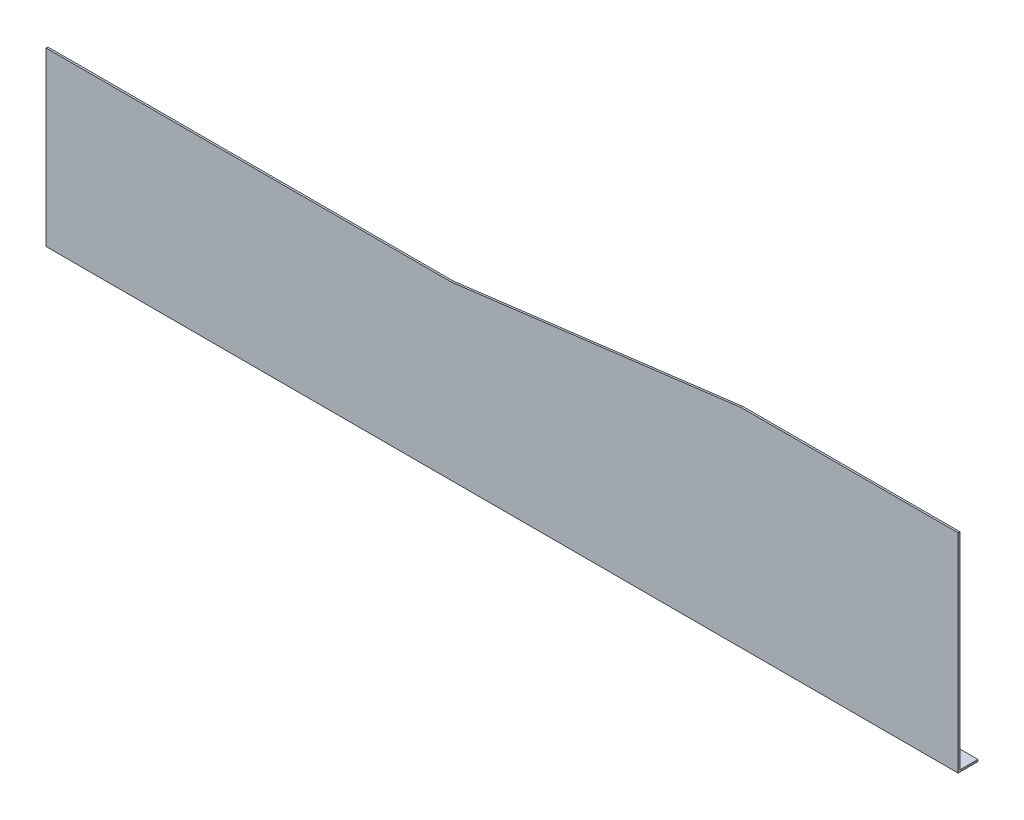
ISO-10303-21;
HEADER;
FILE_DESCRIPTION(('STEP AP214'),'2;1');
FILE_NAME('part.step','',(''),(''),'','','');
FILE_SCHEMA(('AUTOMOTIVE_DESIGN { 1 0 10303 214 1 1 1 1 }'));
ENDSEC;
DATA;
#1=APPLICATION_CONTEXT('core data for automotive mechanical design processes');
#2=APPLICATION_PROTOCOL_DEFINITION('international standard','automotive_design',2000,#1);
#3=PRODUCT_CONTEXT('',#1,'mechanical');
#4=PRODUCT('Part','Part','',(#3));
#5=PRODUCT_RELATED_PRODUCT_CATEGORY('part','',(#4));
#6=PRODUCT_DEFINITION_FORMATION('','',#4);
#7=PRODUCT_DEFINITION_CONTEXT('part definition',#1,'design');
#8=PRODUCT_DEFINITION('design','',#6,#7);
#9=PRODUCT_DEFINITION_SHAPE('','',#8);
#10=(LENGTH_UNIT() NAMED_UNIT(*) SI_UNIT(.MILLI.,.METRE.));
#11=(NAMED_UNIT(*) PLANE_ANGLE_UNIT() SI_UNIT($,.RADIAN.));
#12=(NAMED_UNIT(*) SI_UNIT($,.STERADIAN.) SOLID_ANGLE_UNIT());
#13=UNCERTAINTY_MEASURE_WITH_UNIT(LENGTH_MEASURE(1.E-05),#10,'distance_accuracy_value','');
#14=(GEOMETRIC_REPRESENTATION_CONTEXT(3) GLOBAL_UNCERTAINTY_ASSIGNED_CONTEXT((#13)) GLOBAL_UNIT_ASSIGNED_CONTEXT((#10,
#11,#12)) REPRESENTATION_CONTEXT('',''));
#15=CARTESIAN_POINT('',(0.,0.,0.));
#16=DIRECTION('',(0.,0.,1.));
#17=DIRECTION('',(1.,0.,0.));
#18=AXIS2_PLACEMENT_3D('',#15,#16,#17);
#19=CARTESIAN_POINT('',(630.,0.,1.27));
#20=DIRECTION('',(0.,1.,0.));
#21=DIRECTION('',(-1.,0.,0.));
#22=AXIS2_PLACEMENT_3D('',#19,#20,#21);
#23=PLANE('',#22);
#24=DIRECTION('',(0.,0.,-1.));
#25=VECTOR('',#24,1.);
#26=CARTESIAN_POINT('',(0.,0.,1.27));
#27=LINE('',#26,#25);
#28=CARTESIAN_POINT('',(0.,0.,1.27));
#29=VERTEX_POINT('',#28);
#30=CARTESIAN_POINT('',(0.,0.,-12.5));
#31=VERTEX_POINT('',#30);
#32=EDGE_CURVE('E113',#29,#31,#27,.T.);
#33=ORIENTED_EDGE('',*,*,#32,.T.);
#34=DIRECTION('',(1.,0.,0.));
#35=VECTOR('',#34,1.);
#36=CARTESIAN_POINT('',(0.,0.,-12.5));
#37=LINE('',#36,#35);
#38=CARTESIAN_POINT('',(630.,0.,-12.5));
#39=VERTEX_POINT('',#38);
#40=EDGE_CURVE('E152',#31,#39,#37,.T.);
#41=ORIENTED_EDGE('',*,*,#40,.T.);
#42=DIRECTION('',(0.,0.,-1.));
#43=VECTOR('',#42,1.);
#44=CARTESIAN_POINT('',(630.,0.,1.27));
#45=LINE('',#44,#43);
#46=CARTESIAN_POINT('',(630.,0.,1.27));
#47=VERTEX_POINT('',#46);
#48=EDGE_CURVE('E47',#47,#39,#45,.T.);
#49=ORIENTED_EDGE('',*,*,#48,.F.);
#50=DIRECTION('',(1.,0.,0.));
#51=VECTOR('',#50,1.);
#52=CARTESIAN_POINT('',(630.,0.,1.27));
#53=LINE('',#52,#51);
#54=EDGE_CURVE('E127',#29,#47,#53,.T.);
#55=ORIENTED_EDGE('',*,*,#54,.F.);
#56=EDGE_LOOP('',(#33,#41,#49,#55));
#57=FACE_BOUND('',#56,.T.);
#58=ADVANCED_FACE('F39',(#57),#23,.F.);
#59=CARTESIAN_POINT('',(630.,143.73,1.27));
#60=DIRECTION('',(-1.,0.,0.));
#61=DIRECTION('',(0.,0.,1.));
#62=AXIS2_PLACEMENT_3D('',#59,#60,#61);
#63=PLANE('',#62);
#64=DIRECTION('',(0.,0.,-1.));
#65=VECTOR('',#64,1.);
#66=CARTESIAN_POINT('',(630.,143.73,1.27));
#67=LINE('',#66,#65);
#68=CARTESIAN_POINT('',(630.,143.73,1.27));
#69=VERTEX_POINT('',#68);
#70=CARTESIAN_POINT('',(630.,143.73,0.));
#71=VERTEX_POINT('',#70);
#72=EDGE_CURVE('E132',#69,#71,#67,.T.);
#73=ORIENTED_EDGE('',*,*,#72,.F.);
#74=DIRECTION('',(0.,1.,0.));
#75=VECTOR('',#74,1.);
#76=CARTESIAN_POINT('',(630.,143.73,1.27));
#77=LINE('',#76,#75);
#78=EDGE_CURVE('E89',#47,#69,#77,.T.);
#79=ORIENTED_EDGE('',*,*,#78,.F.);
#80=ORIENTED_EDGE('',*,*,#48,.T.);
#81=DIRECTION('',(0.,1.,0.));
#82=VECTOR('',#81,1.);
#83=CARTESIAN_POINT('',(630.,0.,-12.5));
#84=LINE('',#83,#82);
#85=CARTESIAN_POINT('',(630.,1.27,-12.5));
#86=VERTEX_POINT('',#85);
#87=EDGE_CURVE('E141',#39,#86,#84,.T.);
#88=ORIENTED_EDGE('',*,*,#87,.T.);
#89=DIRECTION('',(0.,0.,1.));
#90=VECTOR('',#89,1.);
#91=CARTESIAN_POINT('',(630.,1.27,-12.5));
#92=LINE('',#91,#90);
#93=CARTESIAN_POINT('',(630.,1.27,0.));
#94=VERTEX_POINT('',#93);
#95=EDGE_CURVE('E162',#86,#94,#92,.T.);
#96=ORIENTED_EDGE('',*,*,#95,.T.);
#97=DIRECTION('',(0.,1.,0.));
#98=VECTOR('',#97,1.);
#99=CARTESIAN_POINT('',(630.,143.73,0.));
#100=LINE('',#99,#98);
#101=EDGE_CURVE('E117',#94,#71,#100,.T.);
#102=ORIENTED_EDGE('',*,*,#101,.T.);
#103=EDGE_LOOP('',(#73,#79,#80,#88,#96,#102));
#104=FACE_BOUND('',#103,.T.);
#105=ADVANCED_FACE('F138',(#104),#63,.F.);
#106=CARTESIAN_POINT('',(480.,143.73,1.27));
#107=DIRECTION('',(0.,-1.,0.));
#108=DIRECTION('',(1.,0.,0.));
#109=AXIS2_PLACEMENT_3D('',#106,#107,#108);
#110=PLANE('',#109);
#111=DIRECTION('',(-1.,0.,0.));
#112=VECTOR('',#111,1.);
#113=CARTESIAN_POINT('',(480.,143.73,0.));
#114=LINE('',#113,#112);
#115=CARTESIAN_POINT('',(480.,143.73,0.));
#116=VERTEX_POINT('',#115);
#117=EDGE_CURVE('E119',#71,#116,#114,.T.);
#118=ORIENTED_EDGE('',*,*,#117,.T.);
#119=DIRECTION('',(0.,0.,-1.));
#120=VECTOR('',#119,1.);
#121=CARTESIAN_POINT('',(480.,143.73,1.27));
#122=LINE('',#121,#120);
#123=CARTESIAN_POINT('',(480.,143.73,1.27));
#124=VERTEX_POINT('',#123);
#125=EDGE_CURVE('E108',#124,#116,#122,.T.);
#126=ORIENTED_EDGE('',*,*,#125,.F.);
#127=DIRECTION('',(-1.,0.,0.));
#128=VECTOR('',#127,1.);
#129=CARTESIAN_POINT('',(480.,143.73,1.27));
#130=LINE('',#129,#128);
#131=EDGE_CURVE('E103',#69,#124,#130,.T.);
#132=ORIENTED_EDGE('',*,*,#131,.F.);
#133=ORIENTED_EDGE('',*,*,#72,.T.);
#134=EDGE_LOOP('',(#118,#126,#132,#133));
#135=FACE_BOUND('',#134,.T.);
#136=ADVANCED_FACE('F170',(#135),#110,.F.);
#137=CARTESIAN_POINT('',(280.,118.73,1.27));
#138=DIRECTION('',(0.124034734589208,-0.992277876713668,0.));
#139=DIRECTION('',(0.992277876713668,0.124034734589208,0.));
#140=AXIS2_PLACEMENT_3D('',#137,#138,#139);
#141=PLANE('',#140);
#142=DIRECTION('',(-0.992277876713668,-0.124034734589208,0.));
#143=VECTOR('',#142,1.);
#144=CARTESIAN_POINT('',(280.,118.73,0.));
#145=LINE('',#144,#143);
#146=CARTESIAN_POINT('',(280.,118.73,0.));
#147=VERTEX_POINT('',#146);
#148=EDGE_CURVE('E73',#116,#147,#145,.T.);
#149=ORIENTED_EDGE('',*,*,#148,.T.);
#150=DIRECTION('',(0.,0.,-1.));
#151=VECTOR('',#150,1.);
#152=CARTESIAN_POINT('',(280.,118.73,1.27));
#153=LINE('',#152,#151);
#154=CARTESIAN_POINT('',(280.,118.73,1.27));
#155=VERTEX_POINT('',#154);
#156=EDGE_CURVE('E106',#155,#147,#153,.T.);
#157=ORIENTED_EDGE('',*,*,#156,.F.);
#158=DIRECTION('',(-0.992277876713668,-0.124034734589208,0.));
#159=VECTOR('',#158,1.);
#160=CARTESIAN_POINT('',(280.,118.73,1.27));
#161=LINE('',#160,#159);
#162=EDGE_CURVE('E98',#124,#155,#161,.T.);
#163=ORIENTED_EDGE('',*,*,#162,.F.);
#164=ORIENTED_EDGE('',*,*,#125,.T.);
#165=EDGE_LOOP('',(#149,#157,#163,#164));
#166=FACE_BOUND('',#165,.T.);
#167=ADVANCED_FACE('F107',(#166),#141,.F.);
#168=CARTESIAN_POINT('',(0.,118.73,1.27));
#169=DIRECTION('',(0.,-1.,0.));
#170=DIRECTION('',(0.,0.,-1.));
#171=AXIS2_PLACEMENT_3D('',#168,#169,#170);
#172=PLANE('',#171);
#173=DIRECTION('',(-1.,0.,0.));
#174=VECTOR('',#173,1.);
#175=CARTESIAN_POINT('',(0.,118.73,0.));
#176=LINE('',#175,#174);
#177=CARTESIAN_POINT('',(0.,118.73,0.));
#178=VERTEX_POINT('',#177);
#179=EDGE_CURVE('E80',#147,#178,#176,.T.);
#180=ORIENTED_EDGE('',*,*,#179,.T.);
#181=DIRECTION('',(0.,0.,-1.));
#182=VECTOR('',#181,1.);
#183=CARTESIAN_POINT('',(0.,118.73,1.27));
#184=LINE('',#183,#182);
#185=CARTESIAN_POINT('',(0.,118.73,1.27));
#186=VERTEX_POINT('',#185);
#187=EDGE_CURVE('E109',#186,#178,#184,.T.);
#188=ORIENTED_EDGE('',*,*,#187,.F.);
#189=DIRECTION('',(-1.,0.,0.));
#190=VECTOR('',#189,1.);
#191=CARTESIAN_POINT('',(0.,118.73,1.27));
#192=LINE('',#191,#190);
#193=EDGE_CURVE('E101',#155,#186,#192,.T.);
#194=ORIENTED_EDGE('',*,*,#193,.F.);
#195=ORIENTED_EDGE('',*,*,#156,.T.);
#196=EDGE_LOOP('',(#180,#188,#194,#195));
#197=FACE_BOUND('',#196,.T.);
#198=ADVANCED_FACE('F111',(#197),#172,.F.);
#199=CARTESIAN_POINT('',(0.,0.,1.27));
#200=DIRECTION('',(1.,0.,0.));
#201=DIRECTION('',(0.,0.,-1.));
#202=AXIS2_PLACEMENT_3D('',#199,#200,#201);
#203=PLANE('',#202);
#204=DIRECTION('',(0.,-1.,0.));
#205=VECTOR('',#204,1.);
#206=CARTESIAN_POINT('',(0.,0.,0.));
#207=LINE('',#206,#205);
#208=CARTESIAN_POINT('',(0.,1.27,0.));
#209=VERTEX_POINT('',#208);
#210=EDGE_CURVE('E124',#178,#209,#207,.T.);
#211=ORIENTED_EDGE('',*,*,#210,.T.);
#212=DIRECTION('',(0.,0.,1.));
#213=VECTOR('',#212,1.);
#214=CARTESIAN_POINT('',(0.,1.27,-12.5));
#215=LINE('',#214,#213);
#216=CARTESIAN_POINT('',(0.,1.27,-12.5));
#217=VERTEX_POINT('',#216);
#218=EDGE_CURVE('E120',#217,#209,#215,.T.);
#219=ORIENTED_EDGE('',*,*,#218,.F.);
#220=DIRECTION('',(0.,-1.,0.));
#221=VECTOR('',#220,1.);
#222=CARTESIAN_POINT('',(0.,0.,-12.5));
#223=LINE('',#222,#221);
#224=EDGE_CURVE('E157',#217,#31,#223,.T.);
#225=ORIENTED_EDGE('',*,*,#224,.T.);
#226=ORIENTED_EDGE('',*,*,#32,.F.);
#227=DIRECTION('',(0.,-1.,0.));
#228=VECTOR('',#227,1.);
#229=CARTESIAN_POINT('',(0.,0.,1.27));
#230=LINE('',#229,#228);
#231=EDGE_CURVE('E55',#186,#29,#230,.T.);
#232=ORIENTED_EDGE('',*,*,#231,.F.);
#233=ORIENTED_EDGE('',*,*,#187,.T.);
#234=EDGE_LOOP('',(#211,#219,#225,#226,#232,#233));
#235=FACE_BOUND('',#234,.T.);
#236=ADVANCED_FACE('F177',(#235),#203,.F.);
#237=CARTESIAN_POINT('',(0.,0.,1.27));
#238=DIRECTION('',(0.,0.,-1.));
#239=DIRECTION('',(-1.,0.,0.));
#240=AXIS2_PLACEMENT_3D('',#237,#238,#239);
#241=PLANE('',#240);
#242=ORIENTED_EDGE('',*,*,#231,.T.);
#243=ORIENTED_EDGE('',*,*,#54,.T.);
#244=ORIENTED_EDGE('',*,*,#78,.T.);
#245=ORIENTED_EDGE('',*,*,#131,.T.);
#246=ORIENTED_EDGE('',*,*,#162,.T.);
#247=ORIENTED_EDGE('',*,*,#193,.T.);
#248=EDGE_LOOP('',(#242,#243,#244,#245,#246,#247));
#249=FACE_BOUND('',#248,.T.);
#250=ADVANCED_FACE('F99',(#249),#241,.F.);
#251=CARTESIAN_POINT('',(0.,0.,0.));
#252=DIRECTION('',(0.,0.,-1.));
#253=DIRECTION('',(-1.,0.,0.));
#254=AXIS2_PLACEMENT_3D('',#251,#252,#253);
#255=PLANE('',#254);
#256=DIRECTION('',(1.,0.,0.));
#257=VECTOR('',#256,1.);
#258=CARTESIAN_POINT('',(0.,1.27,0.));
#259=LINE('',#258,#257);
#260=EDGE_CURVE('E11',#209,#94,#259,.T.);
#261=ORIENTED_EDGE('',*,*,#260,.F.);
#262=ORIENTED_EDGE('',*,*,#210,.F.);
#263=ORIENTED_EDGE('',*,*,#179,.F.);
#264=ORIENTED_EDGE('',*,*,#148,.F.);
#265=ORIENTED_EDGE('',*,*,#117,.F.);
#266=ORIENTED_EDGE('',*,*,#101,.F.);
#267=EDGE_LOOP('',(#261,#262,#263,#264,#265,#266));
#268=FACE_BOUND('',#267,.T.);
#269=ADVANCED_FACE('F173',(#268),#255,.T.);
#270=CARTESIAN_POINT('',(0.,1.27,-12.5));
#271=DIRECTION('',(0.,1.,0.));
#272=DIRECTION('',(0.,0.,1.));
#273=AXIS2_PLACEMENT_3D('',#270,#271,#272);
#274=PLANE('',#273);
#275=ORIENTED_EDGE('',*,*,#218,.T.);
#276=ORIENTED_EDGE('',*,*,#260,.T.);
#277=ORIENTED_EDGE('',*,*,#95,.F.);
#278=DIRECTION('',(-1.,0.,0.));
#279=VECTOR('',#278,1.);
#280=CARTESIAN_POINT('',(0.,1.27,-12.5));
#281=LINE('',#280,#279);
#282=EDGE_CURVE('E155',#86,#217,#281,.T.);
#283=ORIENTED_EDGE('',*,*,#282,.T.);
#284=EDGE_LOOP('',(#275,#276,#277,#283));
#285=FACE_BOUND('',#284,.T.);
#286=ADVANCED_FACE('F185',(#285),#274,.T.);
#287=CARTESIAN_POINT('',(0.,0.,-12.5));
#288=DIRECTION('',(0.,0.,-1.));
#289=DIRECTION('',(-1.,0.,0.));
#290=AXIS2_PLACEMENT_3D('',#287,#288,#289);
#291=PLANE('',#290);
#292=ORIENTED_EDGE('',*,*,#224,.F.);
#293=ORIENTED_EDGE('',*,*,#282,.F.);
#294=ORIENTED_EDGE('',*,*,#87,.F.);
#295=ORIENTED_EDGE('',*,*,#40,.F.);
#296=EDGE_LOOP('',(#292,#293,#294,#295));
#297=FACE_BOUND('',#296,.T.);
#298=ADVANCED_FACE('F151',(#297),#291,.T.);
#299=CLOSED_SHELL('',(#58,#105,#136,#167,#198,#236,#250,#269,#286,#298));
#300=MANIFOLD_SOLID_BREP('B2',#299);
#301=ADVANCED_BREP_SHAPE_REPRESENTATION('',(#18,#300),#14);
#302=SHAPE_DEFINITION_REPRESENTATION(#9,#301);
ENDSEC;
END-ISO-10303-21;
